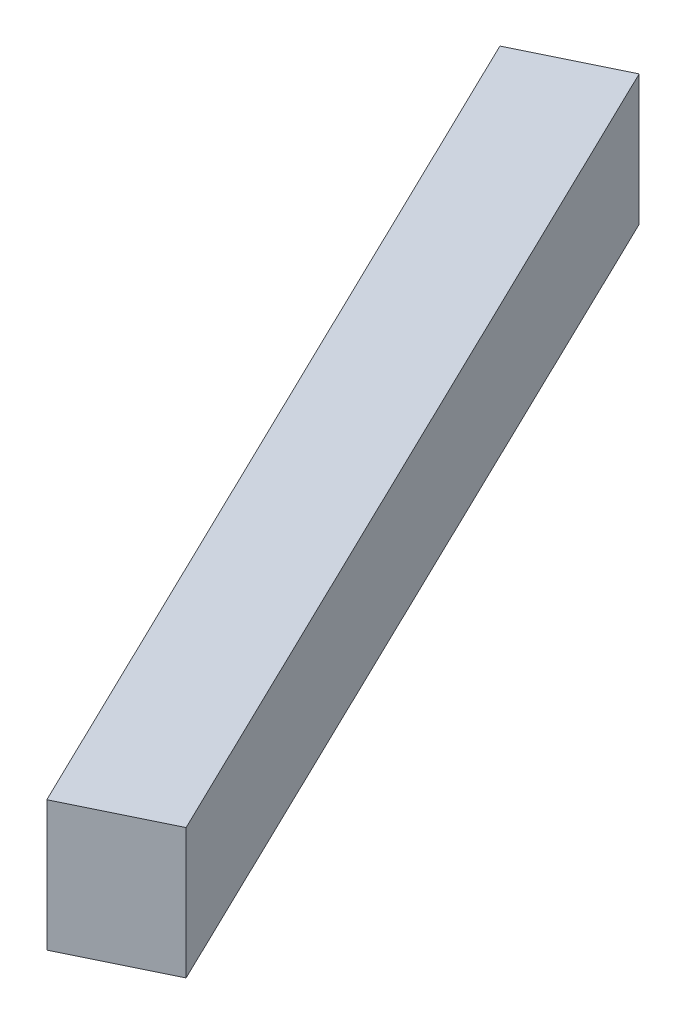
ISO-10303-21;
HEADER;
FILE_DESCRIPTION(('STEP AP214'),'2;1');
FILE_NAME('part.step','',(''),(''),'','','');
FILE_SCHEMA(('AUTOMOTIVE_DESIGN { 1 0 10303 214 1 1 1 1 }'));
ENDSEC;
DATA;
#1=APPLICATION_CONTEXT('core data for automotive mechanical design processes');
#2=APPLICATION_PROTOCOL_DEFINITION('international standard','automotive_design',2000,#1);
#3=PRODUCT_CONTEXT('',#1,'mechanical');
#4=PRODUCT('Part','Part','',(#3));
#5=PRODUCT_RELATED_PRODUCT_CATEGORY('part','',(#4));
#6=PRODUCT_DEFINITION_FORMATION('','',#4);
#7=PRODUCT_DEFINITION_CONTEXT('part definition',#1,'design');
#8=PRODUCT_DEFINITION('design','',#6,#7);
#9=PRODUCT_DEFINITION_SHAPE('','',#8);
#10=(LENGTH_UNIT() NAMED_UNIT(*) SI_UNIT(.MILLI.,.METRE.));
#11=(NAMED_UNIT(*) PLANE_ANGLE_UNIT() SI_UNIT($,.RADIAN.));
#12=(NAMED_UNIT(*) SI_UNIT($,.STERADIAN.) SOLID_ANGLE_UNIT());
#13=UNCERTAINTY_MEASURE_WITH_UNIT(LENGTH_MEASURE(1.E-05),#10,'distance_accuracy_value','');
#14=(GEOMETRIC_REPRESENTATION_CONTEXT(3) GLOBAL_UNCERTAINTY_ASSIGNED_CONTEXT((#13)) GLOBAL_UNIT_ASSIGNED_CONTEXT((#10,
#11,#12)) REPRESENTATION_CONTEXT('',''));
#15=CARTESIAN_POINT('',(0.,0.,0.));
#16=DIRECTION('',(0.,0.,1.));
#17=DIRECTION('',(1.,0.,0.));
#18=AXIS2_PLACEMENT_3D('',#15,#16,#17);
#19=CARTESIAN_POINT('',(7.94081471806527,7.874,16.1514778402019));
#20=DIRECTION('',(-0.899877729673644,0.,0.43614226077899));
#21=DIRECTION('',(0.43614226077899,0.,0.899877729673644));
#22=AXIS2_PLACEMENT_3D('',#19,#20,#21);
#23=PLANE('',#22);
#24=DIRECTION('',(0.,1.,0.));
#25=VECTOR('',#24,1.);
#26=CARTESIAN_POINT('',(7.94081471806527,7.874,16.1514778402019));
#27=LINE('',#26,#25);
#28=CARTESIAN_POINT('',(7.94081471806527,7.62,16.1514778402019));
#29=VERTEX_POINT('',#28);
#30=CARTESIAN_POINT('',(7.94081471806527,7.874,16.1514778402019));
#31=VERTEX_POINT('',#30);
#32=EDGE_CURVE('E20',#29,#31,#27,.T.);
#33=ORIENTED_EDGE('',*,*,#32,.T.);
#34=DIRECTION('',(0.436142260778986,0.,0.899877729673646));
#35=VECTOR('',#34,1.);
#36=CARTESIAN_POINT('',(7.94081471806527,7.874,16.1514778402019));
#37=LINE('',#36,#35);
#38=CARTESIAN_POINT('',(8.77166572484924,7.874,17.8657449152302));
#39=VERTEX_POINT('',#38);
#40=EDGE_CURVE('E55',#31,#39,#37,.T.);
#41=ORIENTED_EDGE('',*,*,#40,.T.);
#42=DIRECTION('',(0.,1.,0.));
#43=VECTOR('',#42,1.);
#44=CARTESIAN_POINT('',(8.77166572484924,7.874,17.8657449152302));
#45=LINE('',#44,#43);
#46=CARTESIAN_POINT('',(8.77166572484924,7.62,17.8657449152302));
#47=VERTEX_POINT('',#46);
#48=EDGE_CURVE('E76',#39,#47,#45,.F.);
#49=ORIENTED_EDGE('',*,*,#48,.T.);
#50=DIRECTION('',(0.436142260778986,0.,0.899877729673646));
#51=VECTOR('',#50,1.);
#52=CARTESIAN_POINT('',(7.94081471806527,7.62,16.1514778402019));
#53=LINE('',#52,#51);
#54=EDGE_CURVE('E58',#29,#47,#53,.T.);
#55=ORIENTED_EDGE('',*,*,#54,.F.);
#56=EDGE_LOOP('',(#33,#41,#49,#55));
#57=FACE_BOUND('',#56,.T.);
#58=ADVANCED_FACE('F17',(#57),#23,.F.);
#59=CARTESIAN_POINT('',(7.94081471806527,7.874,16.1514778402019));
#60=DIRECTION('',(0.436142260779,0.,0.899877729673639));
#61=DIRECTION('',(0.899877729673639,0.,-0.436142260779));
#62=AXIS2_PLACEMENT_3D('',#59,#60,#61);
#63=PLANE('',#62);
#64=DIRECTION('',(0.,1.,0.));
#65=VECTOR('',#64,1.);
#66=CARTESIAN_POINT('',(7.75795956339558,7.874,16.2401019475922));
#67=LINE('',#66,#65);
#68=CARTESIAN_POINT('',(7.75795956339558,7.62,16.2401019475922));
#69=VERTEX_POINT('',#68);
#70=CARTESIAN_POINT('',(7.75795956339558,7.874,16.2401019475922));
#71=VERTEX_POINT('',#70);
#72=EDGE_CURVE('E73',#69,#71,#67,.T.);
#73=ORIENTED_EDGE('',*,*,#72,.T.);
#74=DIRECTION('',(0.899877729673624,0.,-0.436142260779031));
#75=VECTOR('',#74,1.);
#76=CARTESIAN_POINT('',(7.75795956339558,7.874,16.2401019475922));
#77=LINE('',#76,#75);
#78=EDGE_CURVE('E63',#71,#31,#77,.T.);
#79=ORIENTED_EDGE('',*,*,#78,.T.);
#80=ORIENTED_EDGE('',*,*,#32,.F.);
#81=DIRECTION('',(0.899877729673624,0.,-0.436142260779031));
#82=VECTOR('',#81,1.);
#83=CARTESIAN_POINT('',(7.75795956339558,7.62,16.2401019475922));
#84=LINE('',#83,#82);
#85=EDGE_CURVE('E80',#69,#29,#84,.T.);
#86=ORIENTED_EDGE('',*,*,#85,.F.);
#87=EDGE_LOOP('',(#73,#79,#80,#86));
#88=FACE_BOUND('',#87,.T.);
#89=ADVANCED_FACE('F72',(#88),#63,.F.);
#90=CARTESIAN_POINT('',(7.94081471806527,7.874,16.1514778402019));
#91=DIRECTION('',(0.,-1.,0.));
#92=DIRECTION('',(0.,0.,-1.));
#93=AXIS2_PLACEMENT_3D('',#90,#91,#92);
#94=PLANE('',#93);
#95=ORIENTED_EDGE('',*,*,#78,.F.);
#96=DIRECTION('',(-0.436142260778988,0.,-0.899877729673645));
#97=VECTOR('',#96,1.);
#98=CARTESIAN_POINT('',(7.75795956339558,7.874,16.2401019475922));
#99=LINE('',#98,#97);
#100=CARTESIAN_POINT('',(8.58881057031446,7.874,17.9543690228989));
#101=VERTEX_POINT('',#100);
#102=EDGE_CURVE('E83',#71,#101,#99,.F.);
#103=ORIENTED_EDGE('',*,*,#102,.T.);
#104=DIRECTION('',(-0.899877729009695,0.,0.436142262148894));
#105=VECTOR('',#104,1.);
#106=CARTESIAN_POINT('',(8.77166572484924,7.874,17.8657449152302));
#107=LINE('',#106,#105);
#108=EDGE_CURVE('E69',#101,#39,#107,.F.);
#109=ORIENTED_EDGE('',*,*,#108,.T.);
#110=ORIENTED_EDGE('',*,*,#40,.F.);
#111=EDGE_LOOP('',(#95,#103,#109,#110));
#112=FACE_BOUND('',#111,.T.);
#113=ADVANCED_FACE('F66',(#112),#94,.F.);
#114=CARTESIAN_POINT('',(8.77166572484924,7.874,17.8657449152302));
#115=DIRECTION('',(-0.436142262148894,0.,-0.899877729009695));
#116=DIRECTION('',(-0.899877729009695,0.,0.436142262148894));
#117=AXIS2_PLACEMENT_3D('',#114,#115,#116);
#118=PLANE('',#117);
#119=ORIENTED_EDGE('',*,*,#48,.F.);
#120=ORIENTED_EDGE('',*,*,#108,.F.);
#121=DIRECTION('',(0.,1.,0.));
#122=VECTOR('',#121,1.);
#123=CARTESIAN_POINT('',(8.58881057031448,7.874,17.9543690228989));
#124=LINE('',#123,#122);
#125=CARTESIAN_POINT('',(8.58881057031446,7.62,17.9543690228989));
#126=VERTEX_POINT('',#125);
#127=EDGE_CURVE('E26',#101,#126,#124,.F.);
#128=ORIENTED_EDGE('',*,*,#127,.T.);
#129=DIRECTION('',(-0.899877729009621,0.,0.436142262149047));
#130=VECTOR('',#129,1.);
#131=CARTESIAN_POINT('',(8.77166572484924,7.62,17.8657449152302));
#132=LINE('',#131,#130);
#133=EDGE_CURVE('E34',#47,#126,#132,.T.);
#134=ORIENTED_EDGE('',*,*,#133,.F.);
#135=EDGE_LOOP('',(#119,#120,#128,#134));
#136=FACE_BOUND('',#135,.T.);
#137=ADVANCED_FACE('F88',(#136),#118,.F.);
#138=CARTESIAN_POINT('',(7.94081471806527,7.62,16.1514778402019));
#139=DIRECTION('',(0.,-1.,0.));
#140=DIRECTION('',(0.,0.,-1.));
#141=AXIS2_PLACEMENT_3D('',#138,#139,#140);
#142=PLANE('',#141);
#143=DIRECTION('',(-0.436142260778988,0.,-0.899877729673645));
#144=VECTOR('',#143,1.);
#145=CARTESIAN_POINT('',(7.75795956339558,7.62,16.2401019475922));
#146=LINE('',#145,#144);
#147=EDGE_CURVE('E11',#126,#69,#146,.T.);
#148=ORIENTED_EDGE('',*,*,#147,.T.);
#149=ORIENTED_EDGE('',*,*,#85,.T.);
#150=ORIENTED_EDGE('',*,*,#54,.T.);
#151=ORIENTED_EDGE('',*,*,#133,.T.);
#152=EDGE_LOOP('',(#148,#149,#150,#151));
#153=FACE_BOUND('',#152,.T.);
#154=ADVANCED_FACE('F91',(#153),#142,.T.);
#155=CARTESIAN_POINT('',(7.75795956339558,7.874,16.2401019475922));
#156=DIRECTION('',(0.899877729673645,0.,-0.436142260778988));
#157=DIRECTION('',(-0.436142260778988,0.,-0.899877729673645));
#158=AXIS2_PLACEMENT_3D('',#155,#156,#157);
#159=PLANE('',#158);
#160=ORIENTED_EDGE('',*,*,#127,.F.);
#161=ORIENTED_EDGE('',*,*,#102,.F.);
#162=ORIENTED_EDGE('',*,*,#72,.F.);
#163=ORIENTED_EDGE('',*,*,#147,.F.);
#164=EDGE_LOOP('',(#160,#161,#162,#163));
#165=FACE_BOUND('',#164,.T.);
#166=ADVANCED_FACE('F90',(#165),#159,.F.);
#167=CLOSED_SHELL('',(#58,#89,#113,#137,#154,#166));
#168=MANIFOLD_SOLID_BREP('B1',#167);
#169=ADVANCED_BREP_SHAPE_REPRESENTATION('',(#18,#168),#14);
#170=SHAPE_DEFINITION_REPRESENTATION(#9,#169);
ENDSEC;
END-ISO-10303-21;
